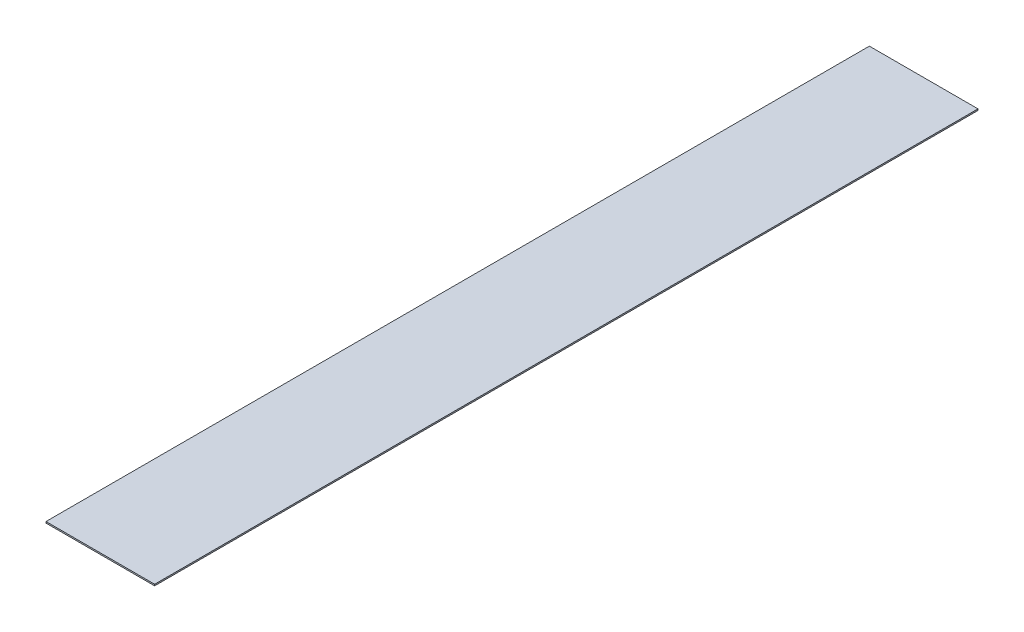
ISO-10303-21;
HEADER;
FILE_DESCRIPTION(('STEP AP214'),'2;1');
FILE_NAME('part.step','',(''),(''),'','','');
FILE_SCHEMA(('AUTOMOTIVE_DESIGN { 1 0 10303 214 1 1 1 1 }'));
ENDSEC;
DATA;
#1=APPLICATION_CONTEXT('core data for automotive mechanical design processes');
#2=APPLICATION_PROTOCOL_DEFINITION('international standard','automotive_design',2000,#1);
#3=PRODUCT_CONTEXT('',#1,'mechanical');
#4=PRODUCT('Part','Part','',(#3));
#5=PRODUCT_RELATED_PRODUCT_CATEGORY('part','',(#4));
#6=PRODUCT_DEFINITION_FORMATION('','',#4);
#7=PRODUCT_DEFINITION_CONTEXT('part definition',#1,'design');
#8=PRODUCT_DEFINITION('design','',#6,#7);
#9=PRODUCT_DEFINITION_SHAPE('','',#8);
#10=(LENGTH_UNIT() NAMED_UNIT(*) SI_UNIT(.MILLI.,.METRE.));
#11=(NAMED_UNIT(*) PLANE_ANGLE_UNIT() SI_UNIT($,.RADIAN.));
#12=(NAMED_UNIT(*) SI_UNIT($,.STERADIAN.) SOLID_ANGLE_UNIT());
#13=UNCERTAINTY_MEASURE_WITH_UNIT(LENGTH_MEASURE(1.E-05),#10,'distance_accuracy_value','');
#14=(GEOMETRIC_REPRESENTATION_CONTEXT(3) GLOBAL_UNCERTAINTY_ASSIGNED_CONTEXT((#13)) GLOBAL_UNIT_ASSIGNED_CONTEXT((#10,
#11,#12)) REPRESENTATION_CONTEXT('',''));
#15=CARTESIAN_POINT('',(0.,0.,0.));
#16=DIRECTION('',(0.,0.,1.));
#17=DIRECTION('',(1.,0.,0.));
#18=AXIS2_PLACEMENT_3D('',#15,#16,#17);
#19=CARTESIAN_POINT('',(-120.65,-1.58750000000001,1828.8));
#20=DIRECTION('',(1.,0.,0.));
#21=DIRECTION('',(0.,0.,-1.));
#22=AXIS2_PLACEMENT_3D('',#19,#20,#21);
#23=PLANE('',#22);
#24=DIRECTION('',(0.,-1.,0.));
#25=VECTOR('',#24,1.);
#26=CARTESIAN_POINT('',(-120.65,-1.58750000000001,0.));
#27=LINE('',#26,#25);
#28=CARTESIAN_POINT('',(-120.65,1.58749999999999,0.));
#29=VERTEX_POINT('',#28);
#30=CARTESIAN_POINT('',(-120.65,-1.58750000000001,0.));
#31=VERTEX_POINT('',#30);
#32=EDGE_CURVE('E109',#29,#31,#27,.T.);
#33=ORIENTED_EDGE('',*,*,#32,.T.);
#34=DIRECTION('',(0.,0.,-1.));
#35=VECTOR('',#34,1.);
#36=CARTESIAN_POINT('',(-120.65,-1.58750000000001,1828.8));
#37=LINE('',#36,#35);
#38=CARTESIAN_POINT('',(-120.65,-1.58750000000001,1828.8));
#39=VERTEX_POINT('',#38);
#40=EDGE_CURVE('E11',#39,#31,#37,.T.);
#41=ORIENTED_EDGE('',*,*,#40,.F.);
#42=DIRECTION('',(0.,-1.,0.));
#43=VECTOR('',#42,1.);
#44=CARTESIAN_POINT('',(-120.65,-1.58750000000001,1828.8));
#45=LINE('',#44,#43);
#46=CARTESIAN_POINT('',(-120.65,1.58749999999999,1828.8));
#47=VERTEX_POINT('',#46);
#48=EDGE_CURVE('E92',#47,#39,#45,.T.);
#49=ORIENTED_EDGE('',*,*,#48,.F.);
#50=DIRECTION('',(0.,0.,-1.));
#51=VECTOR('',#50,1.);
#52=CARTESIAN_POINT('',(-120.65,1.58749999999999,1828.8));
#53=LINE('',#52,#51);
#54=EDGE_CURVE('E105',#47,#29,#53,.T.);
#55=ORIENTED_EDGE('',*,*,#54,.T.);
#56=EDGE_LOOP('',(#33,#41,#49,#55));
#57=FACE_BOUND('',#56,.T.);
#58=ADVANCED_FACE('F40',(#57),#23,.F.);
#59=CARTESIAN_POINT('',(120.65,-1.58749999999998,1828.8));
#60=DIRECTION('',(0.,1.,0.));
#61=DIRECTION('',(-1.,0.,0.));
#62=AXIS2_PLACEMENT_3D('',#59,#60,#61);
#63=PLANE('',#62);
#64=DIRECTION('',(1.,0.,0.));
#65=VECTOR('',#64,1.);
#66=CARTESIAN_POINT('',(120.65,-1.58749999999998,0.));
#67=LINE('',#66,#65);
#68=CARTESIAN_POINT('',(120.65,-1.58749999999998,0.));
#69=VERTEX_POINT('',#68);
#70=EDGE_CURVE('E97',#31,#69,#67,.T.);
#71=ORIENTED_EDGE('',*,*,#70,.T.);
#72=DIRECTION('',(0.,0.,-1.));
#73=VECTOR('',#72,1.);
#74=CARTESIAN_POINT('',(120.65,-1.58749999999998,1828.8));
#75=LINE('',#74,#73);
#76=CARTESIAN_POINT('',(120.65,-1.58749999999998,1828.8));
#77=VERTEX_POINT('',#76);
#78=EDGE_CURVE('E49',#77,#69,#75,.T.);
#79=ORIENTED_EDGE('',*,*,#78,.F.);
#80=DIRECTION('',(1.,0.,0.));
#81=VECTOR('',#80,1.);
#82=CARTESIAN_POINT('',(120.65,-1.58749999999998,1828.8));
#83=LINE('',#82,#81);
#84=EDGE_CURVE('E87',#39,#77,#83,.T.);
#85=ORIENTED_EDGE('',*,*,#84,.F.);
#86=ORIENTED_EDGE('',*,*,#40,.T.);
#87=EDGE_LOOP('',(#71,#79,#85,#86));
#88=FACE_BOUND('',#87,.T.);
#89=ADVANCED_FACE('F96',(#88),#63,.F.);
#90=CARTESIAN_POINT('',(120.65,-1.58749999999998,1828.8));
#91=DIRECTION('',(-1.,0.,0.));
#92=DIRECTION('',(0.,0.,1.));
#93=AXIS2_PLACEMENT_3D('',#90,#91,#92);
#94=PLANE('',#93);
#95=DIRECTION('',(0.,1.,0.));
#96=VECTOR('',#95,1.);
#97=CARTESIAN_POINT('',(120.65,-1.58749999999998,0.));
#98=LINE('',#97,#96);
#99=CARTESIAN_POINT('',(120.65,1.58750000000002,0.));
#100=VERTEX_POINT('',#99);
#101=EDGE_CURVE('E74',#69,#100,#98,.T.);
#102=ORIENTED_EDGE('',*,*,#101,.T.);
#103=DIRECTION('',(0.,0.,-1.));
#104=VECTOR('',#103,1.);
#105=CARTESIAN_POINT('',(120.65,1.58750000000002,1828.8));
#106=LINE('',#105,#104);
#107=CARTESIAN_POINT('',(120.65,1.58750000000002,1828.8));
#108=VERTEX_POINT('',#107);
#109=EDGE_CURVE('E99',#108,#100,#106,.T.);
#110=ORIENTED_EDGE('',*,*,#109,.F.);
#111=DIRECTION('',(0.,1.,0.));
#112=VECTOR('',#111,1.);
#113=CARTESIAN_POINT('',(120.65,-1.58749999999998,1828.8));
#114=LINE('',#113,#112);
#115=EDGE_CURVE('E90',#77,#108,#114,.T.);
#116=ORIENTED_EDGE('',*,*,#115,.F.);
#117=ORIENTED_EDGE('',*,*,#78,.T.);
#118=EDGE_LOOP('',(#102,#110,#116,#117));
#119=FACE_BOUND('',#118,.T.);
#120=ADVANCED_FACE('F100',(#119),#94,.F.);
#121=CARTESIAN_POINT('',(120.65,1.58750000000002,1828.8));
#122=DIRECTION('',(0.,-1.,0.));
#123=DIRECTION('',(1.,0.,0.));
#124=AXIS2_PLACEMENT_3D('',#121,#122,#123);
#125=PLANE('',#124);
#126=DIRECTION('',(-1.,0.,0.));
#127=VECTOR('',#126,1.);
#128=CARTESIAN_POINT('',(120.65,1.58750000000002,0.));
#129=LINE('',#128,#127);
#130=EDGE_CURVE('E80',#100,#29,#129,.T.);
#131=ORIENTED_EDGE('',*,*,#130,.T.);
#132=ORIENTED_EDGE('',*,*,#54,.F.);
#133=DIRECTION('',(-1.,0.,0.));
#134=VECTOR('',#133,1.);
#135=CARTESIAN_POINT('',(120.65,1.58750000000002,1828.8));
#136=LINE('',#135,#134);
#137=EDGE_CURVE('E57',#108,#47,#136,.T.);
#138=ORIENTED_EDGE('',*,*,#137,.F.);
#139=ORIENTED_EDGE('',*,*,#109,.T.);
#140=EDGE_LOOP('',(#131,#132,#138,#139));
#141=FACE_BOUND('',#140,.T.);
#142=ADVANCED_FACE('F123',(#141),#125,.F.);
#143=CARTESIAN_POINT('',(0.,0.,1828.8));
#144=DIRECTION('',(0.,0.,1.));
#145=DIRECTION('',(1.,0.,0.));
#146=AXIS2_PLACEMENT_3D('',#143,#144,#145);
#147=PLANE('',#146);
#148=ORIENTED_EDGE('',*,*,#48,.T.);
#149=ORIENTED_EDGE('',*,*,#84,.T.);
#150=ORIENTED_EDGE('',*,*,#115,.T.);
#151=ORIENTED_EDGE('',*,*,#137,.T.);
#152=EDGE_LOOP('',(#148,#149,#150,#151));
#153=FACE_BOUND('',#152,.T.);
#154=ADVANCED_FACE('F88',(#153),#147,.T.);
#155=CARTESIAN_POINT('',(0.,0.,0.));
#156=DIRECTION('',(0.,0.,1.));
#157=DIRECTION('',(1.,0.,0.));
#158=AXIS2_PLACEMENT_3D('',#155,#156,#157);
#159=PLANE('',#158);
#160=ORIENTED_EDGE('',*,*,#32,.F.);
#161=ORIENTED_EDGE('',*,*,#130,.F.);
#162=ORIENTED_EDGE('',*,*,#101,.F.);
#163=ORIENTED_EDGE('',*,*,#70,.F.);
#164=EDGE_LOOP('',(#160,#161,#162,#163));
#165=FACE_BOUND('',#164,.T.);
#166=ADVANCED_FACE('F126',(#165),#159,.F.);
#167=CLOSED_SHELL('',(#58,#89,#120,#142,#154,#166));
#168=MANIFOLD_SOLID_BREP('B2',#167);
#169=ADVANCED_BREP_SHAPE_REPRESENTATION('',(#18,#168),#14);
#170=SHAPE_DEFINITION_REPRESENTATION(#9,#169);
ENDSEC;
END-ISO-10303-21;
